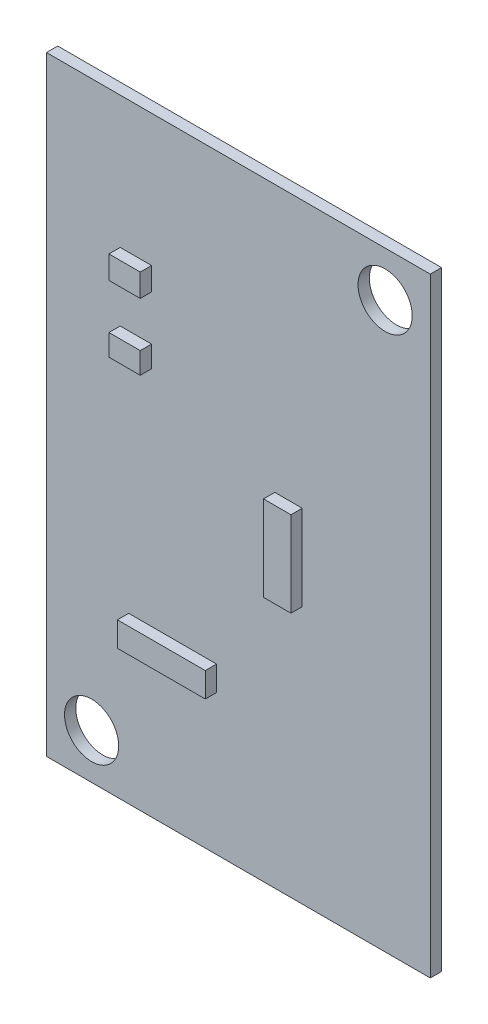
ISO-10303-21;
HEADER;
FILE_DESCRIPTION(('STEP AP214'),'2;1');
FILE_NAME('part.step','',(''),(''),'','','');
FILE_SCHEMA(('AUTOMOTIVE_DESIGN { 1 0 10303 214 1 1 1 1 }'));
ENDSEC;
DATA;
#1=APPLICATION_CONTEXT('core data for automotive mechanical design processes');
#2=APPLICATION_PROTOCOL_DEFINITION('international standard','automotive_design',2000,#1);
#3=PRODUCT_CONTEXT('',#1,'mechanical');
#4=PRODUCT('Part','Part','',(#3));
#5=PRODUCT_RELATED_PRODUCT_CATEGORY('part','',(#4));
#6=PRODUCT_DEFINITION_FORMATION('','',#4);
#7=PRODUCT_DEFINITION_CONTEXT('part definition',#1,'design');
#8=PRODUCT_DEFINITION('design','',#6,#7);
#9=PRODUCT_DEFINITION_SHAPE('','',#8);
#10=(LENGTH_UNIT() NAMED_UNIT(*) SI_UNIT(.MILLI.,.METRE.));
#11=(NAMED_UNIT(*) PLANE_ANGLE_UNIT() SI_UNIT($,.RADIAN.));
#12=(NAMED_UNIT(*) SI_UNIT($,.STERADIAN.) SOLID_ANGLE_UNIT());
#13=UNCERTAINTY_MEASURE_WITH_UNIT(LENGTH_MEASURE(1.E-05),#10,'distance_accuracy_value','');
#14=(GEOMETRIC_REPRESENTATION_CONTEXT(3) GLOBAL_UNCERTAINTY_ASSIGNED_CONTEXT((#13)) GLOBAL_UNIT_ASSIGNED_CONTEXT((#10,
#11,#12)) REPRESENTATION_CONTEXT('',''));
#15=CARTESIAN_POINT('',(0.,0.,0.));
#16=DIRECTION('',(0.,0.,1.));
#17=DIRECTION('',(1.,0.,0.));
#18=AXIS2_PLACEMENT_3D('',#15,#16,#17);
#19=CARTESIAN_POINT('',(0.,0.,0.5));
#20=DIRECTION('',(0.,0.,-1.));
#21=DIRECTION('',(-1.,0.,0.));
#22=AXIS2_PLACEMENT_3D('',#19,#20,#21);
#23=PLANE('',#22);
#24=DIRECTION('',(0.,-1.,0.));
#25=VECTOR('',#24,1.);
#26=CARTESIAN_POINT('',(10.1132934298249,15.1846407659448,0.5));
#27=LINE('',#26,#25);
#28=CARTESIAN_POINT('',(10.1132934298249,15.1846407659448,0.5));
#29=VERTEX_POINT('',#28);
#30=CARTESIAN_POINT('',(10.1132934298249,11.4079215772875,0.5));
#31=VERTEX_POINT('',#30);
#32=EDGE_CURVE('E201',#29,#31,#27,.T.);
#33=ORIENTED_EDGE('',*,*,#32,.F.);
#34=DIRECTION('',(-1.,0.,0.));
#35=VECTOR('',#34,1.);
#36=CARTESIAN_POINT('',(10.1132934298249,15.1846407659448,0.5));
#37=LINE('',#36,#35);
#38=CARTESIAN_POINT('',(11.3299347370059,15.1846407659448,0.5));
#39=VERTEX_POINT('',#38);
#40=EDGE_CURVE('E217',#39,#29,#37,.T.);
#41=ORIENTED_EDGE('',*,*,#40,.F.);
#42=DIRECTION('',(0.,1.,0.));
#43=VECTOR('',#42,1.);
#44=CARTESIAN_POINT('',(11.3299347370059,15.1846407659448,0.5));
#45=LINE('',#44,#43);
#46=CARTESIAN_POINT('',(11.3299347370059,11.4079215772875,0.5));
#47=VERTEX_POINT('',#46);
#48=EDGE_CURVE('E230',#47,#39,#45,.T.);
#49=ORIENTED_EDGE('',*,*,#48,.F.);
#50=DIRECTION('',(1.,0.,0.));
#51=VECTOR('',#50,1.);
#52=CARTESIAN_POINT('',(10.1132934298249,11.4079215772875,0.5));
#53=LINE('',#52,#51);
#54=EDGE_CURVE('E206',#31,#47,#53,.T.);
#55=ORIENTED_EDGE('',*,*,#54,.F.);
#56=EDGE_LOOP('',(#33,#41,#49,#55));
#57=FACE_BOUND('',#56,.T.);
#58=DIRECTION('',(0.,-1.,0.));
#59=VECTOR('',#58,1.);
#60=CARTESIAN_POINT('',(3.26707845600538,21.1574225066613,0.5));
#61=LINE('',#60,#59);
#62=CARTESIAN_POINT('',(3.26707845600538,21.1574225066613,0.5));
#63=VERTEX_POINT('',#62);
#64=CARTESIAN_POINT('',(3.26707845600538,20.1429247999201,0.5));
#65=VERTEX_POINT('',#64);
#66=EDGE_CURVE('E297',#63,#65,#61,.T.);
#67=ORIENTED_EDGE('',*,*,#66,.F.);
#68=DIRECTION('',(-1.,0.,0.));
#69=VECTOR('',#68,1.);
#70=CARTESIAN_POINT('',(3.26707845600538,21.1574225066613,0.5));
#71=LINE('',#70,#69);
#72=CARTESIAN_POINT('',(4.65411513488334,21.1574225066613,0.5));
#73=VERTEX_POINT('',#72);
#74=EDGE_CURVE('E303',#73,#63,#71,.T.);
#75=ORIENTED_EDGE('',*,*,#74,.F.);
#76=DIRECTION('',(0.,1.,0.));
#77=VECTOR('',#76,1.);
#78=CARTESIAN_POINT('',(4.65411513488334,21.1574225066613,0.5));
#79=LINE('',#78,#77);
#80=CARTESIAN_POINT('',(4.65411513488334,20.1429247999201,0.5));
#81=VERTEX_POINT('',#80);
#82=EDGE_CURVE('E320',#81,#73,#79,.T.);
#83=ORIENTED_EDGE('',*,*,#82,.F.);
#84=DIRECTION('',(1.,0.,0.));
#85=VECTOR('',#84,1.);
#86=CARTESIAN_POINT('',(3.26707845600538,20.1429247999201,0.5));
#87=LINE('',#86,#85);
#88=EDGE_CURVE('E316',#65,#81,#87,.T.);
#89=ORIENTED_EDGE('',*,*,#88,.F.);
#90=EDGE_LOOP('',(#67,#75,#83,#89));
#91=FACE_BOUND('',#90,.T.);
#92=CARTESIAN_POINT('',(1.99999999999999,2.,0.5));
#93=DIRECTION('',(0.,0.,1.));
#94=DIRECTION('',(1.,0.,0.));
#95=AXIS2_PLACEMENT_3D('',#92,#93,#94);
#96=CIRCLE('',#95,1.2);
#97=CARTESIAN_POINT('',(3.19999999999999,2.,0.5));
#98=VERTEX_POINT('',#97);
#99=EDGE_CURVE('E343',#98,#98,#96,.T.);
#100=ORIENTED_EDGE('',*,*,#99,.F.);
#101=EDGE_LOOP('',(#100));
#102=FACE_BOUND('',#101,.T.);
#103=CARTESIAN_POINT('',(15.,25.,0.5));
#104=DIRECTION('',(0.,0.,1.));
#105=DIRECTION('',(1.,0.,0.));
#106=AXIS2_PLACEMENT_3D('',#103,#104,#105);
#107=CIRCLE('',#106,1.2);
#108=CARTESIAN_POINT('',(16.2,25.,0.5));
#109=VERTEX_POINT('',#108);
#110=EDGE_CURVE('E342',#109,#109,#107,.T.);
#111=ORIENTED_EDGE('',*,*,#110,.F.);
#112=EDGE_LOOP('',(#111));
#113=FACE_BOUND('',#112,.T.);
#114=DIRECTION('',(0.,-1.,0.));
#115=VECTOR('',#114,1.);
#116=CARTESIAN_POINT('',(0.,0.,0.5));
#117=LINE('',#116,#115);
#118=CARTESIAN_POINT('',(0.,27.,0.5));
#119=VERTEX_POINT('',#118);
#120=CARTESIAN_POINT('',(0.,0.,0.5));
#121=VERTEX_POINT('',#120);
#122=EDGE_CURVE('E359',#119,#121,#117,.T.);
#123=ORIENTED_EDGE('',*,*,#122,.T.);
#124=DIRECTION('',(1.,0.,0.));
#125=VECTOR('',#124,1.);
#126=CARTESIAN_POINT('',(0.,0.,0.5));
#127=LINE('',#126,#125);
#128=CARTESIAN_POINT('',(17.,0.,0.5));
#129=VERTEX_POINT('',#128);
#130=EDGE_CURVE('E363',#121,#129,#127,.T.);
#131=ORIENTED_EDGE('',*,*,#130,.T.);
#132=DIRECTION('',(0.,1.,0.));
#133=VECTOR('',#132,1.);
#134=CARTESIAN_POINT('',(17.,0.,0.5));
#135=LINE('',#134,#133);
#136=CARTESIAN_POINT('',(17.,27.,0.5));
#137=VERTEX_POINT('',#136);
#138=EDGE_CURVE('E367',#129,#137,#135,.T.);
#139=ORIENTED_EDGE('',*,*,#138,.T.);
#140=DIRECTION('',(-1.,0.,0.));
#141=VECTOR('',#140,1.);
#142=CARTESIAN_POINT('',(0.,27.,0.5));
#143=LINE('',#142,#141);
#144=EDGE_CURVE('E370',#137,#119,#143,.T.);
#145=ORIENTED_EDGE('',*,*,#144,.T.);
#146=EDGE_LOOP('',(#123,#131,#139,#145));
#147=FACE_BOUND('',#146,.T.);
#148=DIRECTION('',(0.,-1.,0.));
#149=VECTOR('',#148,1.);
#150=CARTESIAN_POINT('',(3.26707845600538,18.1441707951748,0.5));
#151=LINE('',#150,#149);
#152=CARTESIAN_POINT('',(3.26707845600538,18.1441707951748,0.5));
#153=VERTEX_POINT('',#152);
#154=CARTESIAN_POINT('',(3.26707845600538,17.1966777351997,0.5));
#155=VERTEX_POINT('',#154);
#156=EDGE_CURVE('E252',#153,#155,#151,.T.);
#157=ORIENTED_EDGE('',*,*,#156,.F.);
#158=DIRECTION('',(-1.,0.,0.));
#159=VECTOR('',#158,1.);
#160=CARTESIAN_POINT('',(3.26707845600538,18.1441707951748,0.5));
#161=LINE('',#160,#159);
#162=CARTESIAN_POINT('',(4.65411513488334,18.1441707951748,0.5));
#163=VERTEX_POINT('',#162);
#164=EDGE_CURVE('E258',#163,#153,#161,.T.);
#165=ORIENTED_EDGE('',*,*,#164,.F.);
#166=DIRECTION('',(0.,1.,0.));
#167=VECTOR('',#166,1.);
#168=CARTESIAN_POINT('',(4.65411513488334,18.1441707951748,0.5));
#169=LINE('',#168,#167);
#170=CARTESIAN_POINT('',(4.65411513488334,17.1966777351997,0.5));
#171=VERTEX_POINT('',#170);
#172=EDGE_CURVE('E275',#171,#163,#169,.T.);
#173=ORIENTED_EDGE('',*,*,#172,.F.);
#174=DIRECTION('',(1.,0.,0.));
#175=VECTOR('',#174,1.);
#176=CARTESIAN_POINT('',(3.26707845600538,17.1966777351997,0.5));
#177=LINE('',#176,#175);
#178=EDGE_CURVE('E271',#155,#171,#177,.T.);
#179=ORIENTED_EDGE('',*,*,#178,.F.);
#180=EDGE_LOOP('',(#157,#165,#173,#179));
#181=FACE_BOUND('',#180,.T.);
#182=DIRECTION('',(0.,-1.,0.));
#183=VECTOR('',#182,1.);
#184=CARTESIAN_POINT('',(3.64241793720055,7.3104408157576,0.5));
#185=LINE('',#184,#183);
#186=CARTESIAN_POINT('',(3.64241793720055,7.3104408157576,0.5));
#187=VERTEX_POINT('',#186);
#188=CARTESIAN_POINT('',(3.64241793720055,6.21853176052412,0.5));
#189=VERTEX_POINT('',#188);
#190=EDGE_CURVE('E199',#187,#189,#185,.T.);
#191=ORIENTED_EDGE('',*,*,#190,.F.);
#192=DIRECTION('',(-1.,0.,0.));
#193=VECTOR('',#192,1.);
#194=CARTESIAN_POINT('',(3.64241793720055,7.3104408157576,0.5));
#195=LINE('',#194,#193);
#196=CARTESIAN_POINT('',(7.5348135851101,7.3104408157576,0.5));
#197=VERTEX_POINT('',#196);
#198=EDGE_CURVE('E196',#197,#187,#195,.T.);
#199=ORIENTED_EDGE('',*,*,#198,.F.);
#200=DIRECTION('',(0.,1.,0.));
#201=VECTOR('',#200,1.);
#202=CARTESIAN_POINT('',(7.5348135851101,7.3104408157576,0.5));
#203=LINE('',#202,#201);
#204=CARTESIAN_POINT('',(7.5348135851101,6.21853176052412,0.5));
#205=VERTEX_POINT('',#204);
#206=EDGE_CURVE('E60',#205,#197,#203,.T.);
#207=ORIENTED_EDGE('',*,*,#206,.F.);
#208=DIRECTION('',(1.,0.,0.));
#209=VECTOR('',#208,1.);
#210=CARTESIAN_POINT('',(3.64241793720055,6.21853176052412,0.5));
#211=LINE('',#210,#209);
#212=EDGE_CURVE('E55',#189,#205,#211,.T.);
#213=ORIENTED_EDGE('',*,*,#212,.F.);
#214=EDGE_LOOP('',(#191,#199,#207,#213));
#215=FACE_BOUND('',#214,.T.);
#216=ADVANCED_FACE('F39',(#57,#91,#102,#113,#147,#181,#215),#23,.F.);
#217=CARTESIAN_POINT('',(0.,0.,0.5));
#218=DIRECTION('',(1.,0.,0.));
#219=DIRECTION('',(0.,1.,0.));
#220=AXIS2_PLACEMENT_3D('',#217,#218,#219);
#221=PLANE('',#220);
#222=DIRECTION('',(0.,-1.,0.));
#223=VECTOR('',#222,1.);
#224=CARTESIAN_POINT('',(0.,0.,0.));
#225=LINE('',#224,#223);
#226=CARTESIAN_POINT('',(0.,27.,0.));
#227=VERTEX_POINT('',#226);
#228=CARTESIAN_POINT('',(0.,0.,0.));
#229=VERTEX_POINT('',#228);
#230=EDGE_CURVE('E352',#227,#229,#225,.T.);
#231=ORIENTED_EDGE('',*,*,#230,.T.);
#232=DIRECTION('',(0.,0.,-1.));
#233=VECTOR('',#232,1.);
#234=CARTESIAN_POINT('',(0.,0.,0.5));
#235=LINE('',#234,#233);
#236=EDGE_CURVE('E11',#121,#229,#235,.T.);
#237=ORIENTED_EDGE('',*,*,#236,.F.);
#238=ORIENTED_EDGE('',*,*,#122,.F.);
#239=DIRECTION('',(0.,0.,-1.));
#240=VECTOR('',#239,1.);
#241=CARTESIAN_POINT('',(0.,27.,0.5));
#242=LINE('',#241,#240);
#243=EDGE_CURVE('E373',#119,#227,#242,.T.);
#244=ORIENTED_EDGE('',*,*,#243,.T.);
#245=EDGE_LOOP('',(#231,#237,#238,#244));
#246=FACE_BOUND('',#245,.T.);
#247=ADVANCED_FACE('F41',(#246),#221,.F.);
#248=CARTESIAN_POINT('',(0.,0.,0.5));
#249=DIRECTION('',(0.,1.,0.));
#250=DIRECTION('',(0.,0.,1.));
#251=AXIS2_PLACEMENT_3D('',#248,#249,#250);
#252=PLANE('',#251);
#253=DIRECTION('',(1.,0.,0.));
#254=VECTOR('',#253,1.);
#255=CARTESIAN_POINT('',(0.,0.,0.));
#256=LINE('',#255,#254);
#257=CARTESIAN_POINT('',(17.,0.,0.));
#258=VERTEX_POINT('',#257);
#259=EDGE_CURVE('E377',#229,#258,#256,.T.);
#260=ORIENTED_EDGE('',*,*,#259,.T.);
#261=DIRECTION('',(0.,0.,-1.));
#262=VECTOR('',#261,1.);
#263=CARTESIAN_POINT('',(17.,0.,0.5));
#264=LINE('',#263,#262);
#265=EDGE_CURVE('E48',#129,#258,#264,.T.);
#266=ORIENTED_EDGE('',*,*,#265,.F.);
#267=ORIENTED_EDGE('',*,*,#130,.F.);
#268=ORIENTED_EDGE('',*,*,#236,.T.);
#269=EDGE_LOOP('',(#260,#266,#267,#268));
#270=FACE_BOUND('',#269,.T.);
#271=ADVANCED_FACE('F413',(#270),#252,.F.);
#272=CARTESIAN_POINT('',(17.,0.,0.5));
#273=DIRECTION('',(-1.,0.,0.));
#274=DIRECTION('',(0.,-1.,0.));
#275=AXIS2_PLACEMENT_3D('',#272,#273,#274);
#276=PLANE('',#275);
#277=DIRECTION('',(0.,1.,0.));
#278=VECTOR('',#277,1.);
#279=CARTESIAN_POINT('',(17.,0.,0.));
#280=LINE('',#279,#278);
#281=CARTESIAN_POINT('',(17.,27.,0.));
#282=VERTEX_POINT('',#281);
#283=EDGE_CURVE('E380',#258,#282,#280,.T.);
#284=ORIENTED_EDGE('',*,*,#283,.T.);
#285=DIRECTION('',(0.,0.,-1.));
#286=VECTOR('',#285,1.);
#287=CARTESIAN_POINT('',(17.,27.,0.5));
#288=LINE('',#287,#286);
#289=EDGE_CURVE('E388',#137,#282,#288,.T.);
#290=ORIENTED_EDGE('',*,*,#289,.F.);
#291=ORIENTED_EDGE('',*,*,#138,.F.);
#292=ORIENTED_EDGE('',*,*,#265,.T.);
#293=EDGE_LOOP('',(#284,#290,#291,#292));
#294=FACE_BOUND('',#293,.T.);
#295=ADVANCED_FACE('F397',(#294),#276,.F.);
#296=CARTESIAN_POINT('',(0.,27.,0.5));
#297=DIRECTION('',(0.,-1.,0.));
#298=DIRECTION('',(0.,0.,-1.));
#299=AXIS2_PLACEMENT_3D('',#296,#297,#298);
#300=PLANE('',#299);
#301=DIRECTION('',(-1.,0.,0.));
#302=VECTOR('',#301,1.);
#303=CARTESIAN_POINT('',(0.,27.,0.));
#304=LINE('',#303,#302);
#305=EDGE_CURVE('E364',#282,#227,#304,.T.);
#306=ORIENTED_EDGE('',*,*,#305,.T.);
#307=ORIENTED_EDGE('',*,*,#243,.F.);
#308=ORIENTED_EDGE('',*,*,#144,.F.);
#309=ORIENTED_EDGE('',*,*,#289,.T.);
#310=EDGE_LOOP('',(#306,#307,#308,#309));
#311=FACE_BOUND('',#310,.T.);
#312=ADVANCED_FACE('F406',(#311),#300,.F.);
#313=CARTESIAN_POINT('',(0.,0.,0.));
#314=DIRECTION('',(0.,0.,-1.));
#315=DIRECTION('',(-1.,0.,0.));
#316=AXIS2_PLACEMENT_3D('',#313,#314,#315);
#317=PLANE('',#316);
#318=CARTESIAN_POINT('',(1.99999999999999,2.,0.));
#319=DIRECTION('',(0.,0.,-1.));
#320=DIRECTION('',(-1.,0.,0.));
#321=AXIS2_PLACEMENT_3D('',#318,#319,#320);
#322=CIRCLE('',#321,1.2);
#323=CARTESIAN_POINT('',(0.799999999999995,2.,0.));
#324=VERTEX_POINT('',#323);
#325=EDGE_CURVE('E347',#324,#324,#322,.F.);
#326=ORIENTED_EDGE('',*,*,#325,.T.);
#327=EDGE_LOOP('',(#326));
#328=FACE_BOUND('',#327,.T.);
#329=CARTESIAN_POINT('',(15.,25.,0.));
#330=DIRECTION('',(0.,0.,-1.));
#331=DIRECTION('',(-1.,0.,0.));
#332=AXIS2_PLACEMENT_3D('',#329,#330,#331);
#333=CIRCLE('',#332,1.2);
#334=CARTESIAN_POINT('',(13.8,25.,0.));
#335=VERTEX_POINT('',#334);
#336=EDGE_CURVE('E348',#335,#335,#333,.F.);
#337=ORIENTED_EDGE('',*,*,#336,.T.);
#338=EDGE_LOOP('',(#337));
#339=FACE_BOUND('',#338,.T.);
#340=ORIENTED_EDGE('',*,*,#230,.F.);
#341=ORIENTED_EDGE('',*,*,#305,.F.);
#342=ORIENTED_EDGE('',*,*,#283,.F.);
#343=ORIENTED_EDGE('',*,*,#259,.F.);
#344=EDGE_LOOP('',(#340,#341,#342,#343));
#345=FACE_BOUND('',#344,.T.);
#346=ADVANCED_FACE('F403',(#328,#339,#345),#317,.T.);
#347=CARTESIAN_POINT('',(15.,25.,-3.39411254969543));
#348=DIRECTION('',(0.,0.,1.));
#349=DIRECTION('',(1.,0.,0.));
#350=AXIS2_PLACEMENT_3D('',#347,#348,#349);
#351=CYLINDRICAL_SURFACE('',#350,1.2);
#352=ORIENTED_EDGE('',*,*,#110,.T.);
#353=EDGE_LOOP('',(#352));
#354=FACE_BOUND('',#353,.T.);
#355=ORIENTED_EDGE('',*,*,#336,.F.);
#356=EDGE_LOOP('',(#355));
#357=FACE_BOUND('',#356,.T.);
#358=ADVANCED_FACE('F428',(#354,#357),#351,.F.);
#359=CARTESIAN_POINT('',(1.99999999999999,2.,-3.39411254969543));
#360=DIRECTION('',(0.,0.,1.));
#361=DIRECTION('',(1.,0.,0.));
#362=AXIS2_PLACEMENT_3D('',#359,#360,#361);
#363=CYLINDRICAL_SURFACE('',#362,1.2);
#364=ORIENTED_EDGE('',*,*,#99,.T.);
#365=EDGE_LOOP('',(#364));
#366=FACE_BOUND('',#365,.T.);
#367=ORIENTED_EDGE('',*,*,#325,.F.);
#368=EDGE_LOOP('',(#367));
#369=FACE_BOUND('',#368,.T.);
#370=ADVANCED_FACE('F448',(#366,#369),#363,.F.);
#371=CARTESIAN_POINT('',(3.26707845600538,21.1574225066613,1.));
#372=DIRECTION('',(1.,0.,0.));
#373=DIRECTION('',(0.,0.,-1.));
#374=AXIS2_PLACEMENT_3D('',#371,#372,#373);
#375=PLANE('',#374);
#376=ORIENTED_EDGE('',*,*,#66,.T.);
#377=DIRECTION('',(0.,0.,-1.));
#378=VECTOR('',#377,1.);
#379=CARTESIAN_POINT('',(3.26707845600538,20.1429247999201,1.));
#380=LINE('',#379,#378);
#381=CARTESIAN_POINT('',(3.26707845600538,20.1429247999201,1.));
#382=VERTEX_POINT('',#381);
#383=EDGE_CURVE('E338',#382,#65,#380,.T.);
#384=ORIENTED_EDGE('',*,*,#383,.F.);
#385=DIRECTION('',(0.,-1.,0.));
#386=VECTOR('',#385,1.);
#387=CARTESIAN_POINT('',(3.26707845600538,21.1574225066613,1.));
#388=LINE('',#387,#386);
#389=CARTESIAN_POINT('',(3.26707845600538,21.1574225066613,1.));
#390=VERTEX_POINT('',#389);
#391=EDGE_CURVE('E298',#390,#382,#388,.T.);
#392=ORIENTED_EDGE('',*,*,#391,.F.);
#393=DIRECTION('',(0.,0.,-1.));
#394=VECTOR('',#393,1.);
#395=CARTESIAN_POINT('',(3.26707845600538,21.1574225066613,1.));
#396=LINE('',#395,#394);
#397=EDGE_CURVE('E312',#390,#63,#396,.T.);
#398=ORIENTED_EDGE('',*,*,#397,.T.);
#399=EDGE_LOOP('',(#376,#384,#392,#398));
#400=FACE_BOUND('',#399,.T.);
#401=ADVANCED_FACE('F455',(#400),#375,.F.);
#402=CARTESIAN_POINT('',(3.26707845600538,20.1429247999201,1.));
#403=DIRECTION('',(0.,1.,0.));
#404=DIRECTION('',(0.,0.,1.));
#405=AXIS2_PLACEMENT_3D('',#402,#403,#404);
#406=PLANE('',#405);
#407=ORIENTED_EDGE('',*,*,#88,.T.);
#408=DIRECTION('',(0.,0.,-1.));
#409=VECTOR('',#408,1.);
#410=CARTESIAN_POINT('',(4.65411513488334,20.1429247999201,1.));
#411=LINE('',#410,#409);
#412=CARTESIAN_POINT('',(4.65411513488334,20.1429247999201,1.));
#413=VERTEX_POINT('',#412);
#414=EDGE_CURVE('E334',#413,#81,#411,.T.);
#415=ORIENTED_EDGE('',*,*,#414,.F.);
#416=DIRECTION('',(1.,0.,0.));
#417=VECTOR('',#416,1.);
#418=CARTESIAN_POINT('',(3.26707845600538,20.1429247999201,1.));
#419=LINE('',#418,#417);
#420=EDGE_CURVE('E302',#382,#413,#419,.T.);
#421=ORIENTED_EDGE('',*,*,#420,.F.);
#422=ORIENTED_EDGE('',*,*,#383,.T.);
#423=EDGE_LOOP('',(#407,#415,#421,#422));
#424=FACE_BOUND('',#423,.T.);
#425=ADVANCED_FACE('F462',(#424),#406,.F.);
#426=CARTESIAN_POINT('',(4.65411513488334,21.1574225066613,1.));
#427=DIRECTION('',(-1.,0.,0.));
#428=DIRECTION('',(0.,0.,1.));
#429=AXIS2_PLACEMENT_3D('',#426,#427,#428);
#430=PLANE('',#429);
#431=ORIENTED_EDGE('',*,*,#82,.T.);
#432=DIRECTION('',(0.,0.,-1.));
#433=VECTOR('',#432,1.);
#434=CARTESIAN_POINT('',(4.65411513488334,21.1574225066613,1.));
#435=LINE('',#434,#433);
#436=CARTESIAN_POINT('',(4.65411513488334,21.1574225066613,1.));
#437=VERTEX_POINT('',#436);
#438=EDGE_CURVE('E330',#437,#73,#435,.T.);
#439=ORIENTED_EDGE('',*,*,#438,.F.);
#440=DIRECTION('',(0.,1.,0.));
#441=VECTOR('',#440,1.);
#442=CARTESIAN_POINT('',(4.65411513488334,21.1574225066613,1.));
#443=LINE('',#442,#441);
#444=EDGE_CURVE('E306',#413,#437,#443,.T.);
#445=ORIENTED_EDGE('',*,*,#444,.F.);
#446=ORIENTED_EDGE('',*,*,#414,.T.);
#447=EDGE_LOOP('',(#431,#439,#445,#446));
#448=FACE_BOUND('',#447,.T.);
#449=ADVANCED_FACE('F470',(#448),#430,.F.);
#450=CARTESIAN_POINT('',(3.26707845600538,21.1574225066613,1.));
#451=DIRECTION('',(0.,-1.,0.));
#452=DIRECTION('',(0.,0.,-1.));
#453=AXIS2_PLACEMENT_3D('',#450,#451,#452);
#454=PLANE('',#453);
#455=ORIENTED_EDGE('',*,*,#74,.T.);
#456=ORIENTED_EDGE('',*,*,#397,.F.);
#457=DIRECTION('',(-1.,0.,0.));
#458=VECTOR('',#457,1.);
#459=CARTESIAN_POINT('',(3.26707845600538,21.1574225066613,1.));
#460=LINE('',#459,#458);
#461=EDGE_CURVE('E309',#437,#390,#460,.T.);
#462=ORIENTED_EDGE('',*,*,#461,.F.);
#463=ORIENTED_EDGE('',*,*,#438,.T.);
#464=EDGE_LOOP('',(#455,#456,#462,#463));
#465=FACE_BOUND('',#464,.T.);
#466=ADVANCED_FACE('F478',(#465),#454,.F.);
#467=CARTESIAN_POINT('',(0.,0.,1.));
#468=DIRECTION('',(0.,0.,1.));
#469=DIRECTION('',(1.,0.,0.));
#470=AXIS2_PLACEMENT_3D('',#467,#468,#469);
#471=PLANE('',#470);
#472=ORIENTED_EDGE('',*,*,#391,.T.);
#473=ORIENTED_EDGE('',*,*,#420,.T.);
#474=ORIENTED_EDGE('',*,*,#444,.T.);
#475=ORIENTED_EDGE('',*,*,#461,.T.);
#476=EDGE_LOOP('',(#472,#473,#474,#475));
#477=FACE_BOUND('',#476,.T.);
#478=ADVANCED_FACE('F486',(#477),#471,.T.);
#479=CARTESIAN_POINT('',(3.26707845600538,18.1441707951748,1.));
#480=DIRECTION('',(1.,0.,0.));
#481=DIRECTION('',(0.,0.,-1.));
#482=AXIS2_PLACEMENT_3D('',#479,#480,#481);
#483=PLANE('',#482);
#484=ORIENTED_EDGE('',*,*,#156,.T.);
#485=DIRECTION('',(0.,0.,-1.));
#486=VECTOR('',#485,1.);
#487=CARTESIAN_POINT('',(3.26707845600538,17.1966777351997,1.));
#488=LINE('',#487,#486);
#489=CARTESIAN_POINT('',(3.26707845600538,17.1966777351997,1.));
#490=VERTEX_POINT('',#489);
#491=EDGE_CURVE('E293',#490,#155,#488,.T.);
#492=ORIENTED_EDGE('',*,*,#491,.F.);
#493=DIRECTION('',(0.,-1.,0.));
#494=VECTOR('',#493,1.);
#495=CARTESIAN_POINT('',(3.26707845600538,18.1441707951748,1.));
#496=LINE('',#495,#494);
#497=CARTESIAN_POINT('',(3.26707845600538,18.1441707951748,1.));
#498=VERTEX_POINT('',#497);
#499=EDGE_CURVE('E253',#498,#490,#496,.T.);
#500=ORIENTED_EDGE('',*,*,#499,.F.);
#501=DIRECTION('',(0.,0.,-1.));
#502=VECTOR('',#501,1.);
#503=CARTESIAN_POINT('',(3.26707845600538,18.1441707951748,1.));
#504=LINE('',#503,#502);
#505=EDGE_CURVE('E267',#498,#153,#504,.T.);
#506=ORIENTED_EDGE('',*,*,#505,.T.);
#507=EDGE_LOOP('',(#484,#492,#500,#506));
#508=FACE_BOUND('',#507,.T.);
#509=ADVANCED_FACE('F494',(#508),#483,.F.);
#510=CARTESIAN_POINT('',(3.26707845600538,17.1966777351997,1.));
#511=DIRECTION('',(0.,1.,0.));
#512=DIRECTION('',(0.,0.,1.));
#513=AXIS2_PLACEMENT_3D('',#510,#511,#512);
#514=PLANE('',#513);
#515=ORIENTED_EDGE('',*,*,#178,.T.);
#516=DIRECTION('',(0.,0.,-1.));
#517=VECTOR('',#516,1.);
#518=CARTESIAN_POINT('',(4.65411513488334,17.1966777351997,1.));
#519=LINE('',#518,#517);
#520=CARTESIAN_POINT('',(4.65411513488334,17.1966777351997,1.));
#521=VERTEX_POINT('',#520);
#522=EDGE_CURVE('E289',#521,#171,#519,.T.);
#523=ORIENTED_EDGE('',*,*,#522,.F.);
#524=DIRECTION('',(1.,0.,0.));
#525=VECTOR('',#524,1.);
#526=CARTESIAN_POINT('',(3.26707845600538,17.1966777351997,1.));
#527=LINE('',#526,#525);
#528=EDGE_CURVE('E257',#490,#521,#527,.T.);
#529=ORIENTED_EDGE('',*,*,#528,.F.);
#530=ORIENTED_EDGE('',*,*,#491,.T.);
#531=EDGE_LOOP('',(#515,#523,#529,#530));
#532=FACE_BOUND('',#531,.T.);
#533=ADVANCED_FACE('F502',(#532),#514,.F.);
#534=CARTESIAN_POINT('',(4.65411513488334,18.1441707951748,1.));
#535=DIRECTION('',(-1.,0.,0.));
#536=DIRECTION('',(0.,0.,1.));
#537=AXIS2_PLACEMENT_3D('',#534,#535,#536);
#538=PLANE('',#537);
#539=ORIENTED_EDGE('',*,*,#172,.T.);
#540=DIRECTION('',(0.,0.,-1.));
#541=VECTOR('',#540,1.);
#542=CARTESIAN_POINT('',(4.65411513488334,18.1441707951748,1.));
#543=LINE('',#542,#541);
#544=CARTESIAN_POINT('',(4.65411513488334,18.1441707951748,1.));
#545=VERTEX_POINT('',#544);
#546=EDGE_CURVE('E285',#545,#163,#543,.T.);
#547=ORIENTED_EDGE('',*,*,#546,.F.);
#548=DIRECTION('',(0.,1.,0.));
#549=VECTOR('',#548,1.);
#550=CARTESIAN_POINT('',(4.65411513488334,18.1441707951748,1.));
#551=LINE('',#550,#549);
#552=EDGE_CURVE('E261',#521,#545,#551,.T.);
#553=ORIENTED_EDGE('',*,*,#552,.F.);
#554=ORIENTED_EDGE('',*,*,#522,.T.);
#555=EDGE_LOOP('',(#539,#547,#553,#554));
#556=FACE_BOUND('',#555,.T.);
#557=ADVANCED_FACE('F510',(#556),#538,.F.);
#558=CARTESIAN_POINT('',(3.26707845600538,18.1441707951748,1.));
#559=DIRECTION('',(0.,-1.,0.));
#560=DIRECTION('',(0.,0.,-1.));
#561=AXIS2_PLACEMENT_3D('',#558,#559,#560);
#562=PLANE('',#561);
#563=ORIENTED_EDGE('',*,*,#164,.T.);
#564=ORIENTED_EDGE('',*,*,#505,.F.);
#565=DIRECTION('',(-1.,0.,0.));
#566=VECTOR('',#565,1.);
#567=CARTESIAN_POINT('',(3.26707845600538,18.1441707951748,1.));
#568=LINE('',#567,#566);
#569=EDGE_CURVE('E264',#545,#498,#568,.T.);
#570=ORIENTED_EDGE('',*,*,#569,.F.);
#571=ORIENTED_EDGE('',*,*,#546,.T.);
#572=EDGE_LOOP('',(#563,#564,#570,#571));
#573=FACE_BOUND('',#572,.T.);
#574=ADVANCED_FACE('F518',(#573),#562,.F.);
#575=CARTESIAN_POINT('',(0.,0.,1.));
#576=DIRECTION('',(0.,0.,1.));
#577=DIRECTION('',(1.,0.,0.));
#578=AXIS2_PLACEMENT_3D('',#575,#576,#577);
#579=PLANE('',#578);
#580=ORIENTED_EDGE('',*,*,#499,.T.);
#581=ORIENTED_EDGE('',*,*,#528,.T.);
#582=ORIENTED_EDGE('',*,*,#552,.T.);
#583=ORIENTED_EDGE('',*,*,#569,.T.);
#584=EDGE_LOOP('',(#580,#581,#582,#583));
#585=FACE_BOUND('',#584,.T.);
#586=ADVANCED_FACE('F526',(#585),#579,.T.);
#587=CARTESIAN_POINT('',(10.1132934298249,15.1846407659448,1.));
#588=DIRECTION('',(1.,0.,0.));
#589=DIRECTION('',(0.,0.,-1.));
#590=AXIS2_PLACEMENT_3D('',#587,#588,#589);
#591=PLANE('',#590);
#592=ORIENTED_EDGE('',*,*,#32,.T.);
#593=DIRECTION('',(0.,0.,-1.));
#594=VECTOR('',#593,1.);
#595=CARTESIAN_POINT('',(10.1132934298249,11.4079215772875,1.));
#596=LINE('',#595,#594);
#597=CARTESIAN_POINT('',(10.1132934298249,11.4079215772875,1.));
#598=VERTEX_POINT('',#597);
#599=EDGE_CURVE('E248',#598,#31,#596,.T.);
#600=ORIENTED_EDGE('',*,*,#599,.F.);
#601=DIRECTION('',(0.,-1.,0.));
#602=VECTOR('',#601,1.);
#603=CARTESIAN_POINT('',(10.1132934298249,15.1846407659448,1.));
#604=LINE('',#603,#602);
#605=CARTESIAN_POINT('',(10.1132934298249,15.1846407659448,1.));
#606=VERTEX_POINT('',#605);
#607=EDGE_CURVE('E212',#606,#598,#604,.T.);
#608=ORIENTED_EDGE('',*,*,#607,.F.);
#609=DIRECTION('',(0.,0.,-1.));
#610=VECTOR('',#609,1.);
#611=CARTESIAN_POINT('',(10.1132934298249,15.1846407659448,1.));
#612=LINE('',#611,#610);
#613=EDGE_CURVE('E225',#606,#29,#612,.T.);
#614=ORIENTED_EDGE('',*,*,#613,.T.);
#615=EDGE_LOOP('',(#592,#600,#608,#614));
#616=FACE_BOUND('',#615,.T.);
#617=ADVANCED_FACE('F534',(#616),#591,.F.);
#618=CARTESIAN_POINT('',(10.1132934298249,11.4079215772875,1.));
#619=DIRECTION('',(0.,1.,0.));
#620=DIRECTION('',(0.,0.,1.));
#621=AXIS2_PLACEMENT_3D('',#618,#619,#620);
#622=PLANE('',#621);
#623=ORIENTED_EDGE('',*,*,#54,.T.);
#624=DIRECTION('',(0.,0.,-1.));
#625=VECTOR('',#624,1.);
#626=CARTESIAN_POINT('',(11.3299347370059,11.4079215772875,1.));
#627=LINE('',#626,#625);
#628=CARTESIAN_POINT('',(11.3299347370059,11.4079215772875,1.));
#629=VERTEX_POINT('',#628);
#630=EDGE_CURVE('E244',#629,#47,#627,.T.);
#631=ORIENTED_EDGE('',*,*,#630,.F.);
#632=DIRECTION('',(1.,0.,0.));
#633=VECTOR('',#632,1.);
#634=CARTESIAN_POINT('',(10.1132934298249,11.4079215772875,1.));
#635=LINE('',#634,#633);
#636=EDGE_CURVE('E216',#598,#629,#635,.T.);
#637=ORIENTED_EDGE('',*,*,#636,.F.);
#638=ORIENTED_EDGE('',*,*,#599,.T.);
#639=EDGE_LOOP('',(#623,#631,#637,#638));
#640=FACE_BOUND('',#639,.T.);
#641=ADVANCED_FACE('F542',(#640),#622,.F.);
#642=CARTESIAN_POINT('',(11.3299347370059,15.1846407659448,1.));
#643=DIRECTION('',(-1.,0.,0.));
#644=DIRECTION('',(0.,0.,1.));
#645=AXIS2_PLACEMENT_3D('',#642,#643,#644);
#646=PLANE('',#645);
#647=ORIENTED_EDGE('',*,*,#48,.T.);
#648=DIRECTION('',(0.,0.,-1.));
#649=VECTOR('',#648,1.);
#650=CARTESIAN_POINT('',(11.3299347370059,15.1846407659448,1.));
#651=LINE('',#650,#649);
#652=CARTESIAN_POINT('',(11.3299347370059,15.1846407659448,1.));
#653=VERTEX_POINT('',#652);
#654=EDGE_CURVE('E240',#653,#39,#651,.T.);
#655=ORIENTED_EDGE('',*,*,#654,.F.);
#656=DIRECTION('',(0.,1.,0.));
#657=VECTOR('',#656,1.);
#658=CARTESIAN_POINT('',(11.3299347370059,15.1846407659448,1.));
#659=LINE('',#658,#657);
#660=EDGE_CURVE('E220',#629,#653,#659,.T.);
#661=ORIENTED_EDGE('',*,*,#660,.F.);
#662=ORIENTED_EDGE('',*,*,#630,.T.);
#663=EDGE_LOOP('',(#647,#655,#661,#662));
#664=FACE_BOUND('',#663,.T.);
#665=ADVANCED_FACE('F550',(#664),#646,.F.);
#666=CARTESIAN_POINT('',(10.1132934298249,15.1846407659448,1.));
#667=DIRECTION('',(0.,-1.,0.));
#668=DIRECTION('',(0.,0.,-1.));
#669=AXIS2_PLACEMENT_3D('',#666,#667,#668);
#670=PLANE('',#669);
#671=ORIENTED_EDGE('',*,*,#40,.T.);
#672=ORIENTED_EDGE('',*,*,#613,.F.);
#673=DIRECTION('',(-1.,0.,0.));
#674=VECTOR('',#673,1.);
#675=CARTESIAN_POINT('',(10.1132934298249,15.1846407659448,1.));
#676=LINE('',#675,#674);
#677=EDGE_CURVE('E223',#653,#606,#676,.T.);
#678=ORIENTED_EDGE('',*,*,#677,.F.);
#679=ORIENTED_EDGE('',*,*,#654,.T.);
#680=EDGE_LOOP('',(#671,#672,#678,#679));
#681=FACE_BOUND('',#680,.T.);
#682=ADVANCED_FACE('F558',(#681),#670,.F.);
#683=CARTESIAN_POINT('',(0.,0.,1.));
#684=DIRECTION('',(0.,0.,1.));
#685=DIRECTION('',(1.,0.,0.));
#686=AXIS2_PLACEMENT_3D('',#683,#684,#685);
#687=PLANE('',#686);
#688=ORIENTED_EDGE('',*,*,#607,.T.);
#689=ORIENTED_EDGE('',*,*,#636,.T.);
#690=ORIENTED_EDGE('',*,*,#660,.T.);
#691=ORIENTED_EDGE('',*,*,#677,.T.);
#692=EDGE_LOOP('',(#688,#689,#690,#691));
#693=FACE_BOUND('',#692,.T.);
#694=ADVANCED_FACE('F566',(#693),#687,.T.);
#695=CARTESIAN_POINT('',(3.64241793720055,7.3104408157576,1.));
#696=DIRECTION('',(1.,0.,0.));
#697=DIRECTION('',(0.,0.,-1.));
#698=AXIS2_PLACEMENT_3D('',#695,#696,#697);
#699=PLANE('',#698);
#700=ORIENTED_EDGE('',*,*,#190,.T.);
#701=DIRECTION('',(0.,0.,-1.));
#702=VECTOR('',#701,1.);
#703=CARTESIAN_POINT('',(3.64241793720055,6.21853176052412,1.));
#704=LINE('',#703,#702);
#705=CARTESIAN_POINT('',(3.64241793720055,6.21853176052412,1.));
#706=VERTEX_POINT('',#705);
#707=EDGE_CURVE('E178',#706,#189,#704,.T.);
#708=ORIENTED_EDGE('',*,*,#707,.F.);
#709=DIRECTION('',(0.,-1.,0.));
#710=VECTOR('',#709,1.);
#711=CARTESIAN_POINT('',(3.64241793720055,7.3104408157576,1.));
#712=LINE('',#711,#710);
#713=CARTESIAN_POINT('',(3.64241793720055,7.3104408157576,1.));
#714=VERTEX_POINT('',#713);
#715=EDGE_CURVE('E186',#714,#706,#712,.T.);
#716=ORIENTED_EDGE('',*,*,#715,.F.);
#717=DIRECTION('',(0.,0.,-1.));
#718=VECTOR('',#717,1.);
#719=CARTESIAN_POINT('',(3.64241793720055,7.3104408157576,1.));
#720=LINE('',#719,#718);
#721=EDGE_CURVE('E679',#714,#187,#720,.T.);
#722=ORIENTED_EDGE('',*,*,#721,.T.);
#723=EDGE_LOOP('',(#700,#708,#716,#722));
#724=FACE_BOUND('',#723,.T.);
#725=ADVANCED_FACE('F198',(#724),#699,.F.);
#726=CARTESIAN_POINT('',(3.64241793720055,6.21853176052412,1.));
#727=DIRECTION('',(0.,1.,0.));
#728=DIRECTION('',(0.,0.,1.));
#729=AXIS2_PLACEMENT_3D('',#726,#727,#728);
#730=PLANE('',#729);
#731=ORIENTED_EDGE('',*,*,#212,.T.);
#732=DIRECTION('',(0.,0.,-1.));
#733=VECTOR('',#732,1.);
#734=CARTESIAN_POINT('',(7.5348135851101,6.21853176052412,1.));
#735=LINE('',#734,#733);
#736=CARTESIAN_POINT('',(7.5348135851101,6.21853176052412,1.));
#737=VERTEX_POINT('',#736);
#738=EDGE_CURVE('E181',#737,#205,#735,.T.);
#739=ORIENTED_EDGE('',*,*,#738,.F.);
#740=DIRECTION('',(1.,0.,0.));
#741=VECTOR('',#740,1.);
#742=CARTESIAN_POINT('',(3.64241793720055,6.21853176052412,1.));
#743=LINE('',#742,#741);
#744=EDGE_CURVE('E174',#706,#737,#743,.T.);
#745=ORIENTED_EDGE('',*,*,#744,.F.);
#746=ORIENTED_EDGE('',*,*,#707,.T.);
#747=EDGE_LOOP('',(#731,#739,#745,#746));
#748=FACE_BOUND('',#747,.T.);
#749=ADVANCED_FACE('F176',(#748),#730,.F.);
#750=CARTESIAN_POINT('',(7.5348135851101,7.3104408157576,1.));
#751=DIRECTION('',(-1.,0.,0.));
#752=DIRECTION('',(0.,0.,1.));
#753=AXIS2_PLACEMENT_3D('',#750,#751,#752);
#754=PLANE('',#753);
#755=ORIENTED_EDGE('',*,*,#206,.T.);
#756=DIRECTION('',(0.,0.,-1.));
#757=VECTOR('',#756,1.);
#758=CARTESIAN_POINT('',(7.5348135851101,7.3104408157576,1.));
#759=LINE('',#758,#757);
#760=CARTESIAN_POINT('',(7.5348135851101,7.3104408157576,1.));
#761=VERTEX_POINT('',#760);
#762=EDGE_CURVE('E208',#761,#197,#759,.T.);
#763=ORIENTED_EDGE('',*,*,#762,.F.);
#764=DIRECTION('',(0.,1.,0.));
#765=VECTOR('',#764,1.);
#766=CARTESIAN_POINT('',(7.5348135851101,7.3104408157576,1.));
#767=LINE('',#766,#765);
#768=EDGE_CURVE('E185',#737,#761,#767,.T.);
#769=ORIENTED_EDGE('',*,*,#768,.F.);
#770=ORIENTED_EDGE('',*,*,#738,.T.);
#771=EDGE_LOOP('',(#755,#763,#769,#770));
#772=FACE_BOUND('',#771,.T.);
#773=ADVANCED_FACE('F587',(#772),#754,.F.);
#774=CARTESIAN_POINT('',(3.64241793720055,7.3104408157576,1.));
#775=DIRECTION('',(0.,-1.,0.));
#776=DIRECTION('',(0.,0.,-1.));
#777=AXIS2_PLACEMENT_3D('',#774,#775,#776);
#778=PLANE('',#777);
#779=ORIENTED_EDGE('',*,*,#198,.T.);
#780=ORIENTED_EDGE('',*,*,#721,.F.);
#781=DIRECTION('',(-1.,0.,0.));
#782=VECTOR('',#781,1.);
#783=CARTESIAN_POINT('',(3.64241793720055,7.3104408157576,1.));
#784=LINE('',#783,#782);
#785=EDGE_CURVE('E191',#761,#714,#784,.T.);
#786=ORIENTED_EDGE('',*,*,#785,.F.);
#787=ORIENTED_EDGE('',*,*,#762,.T.);
#788=EDGE_LOOP('',(#779,#780,#786,#787));
#789=FACE_BOUND('',#788,.T.);
#790=ADVANCED_FACE('F594',(#789),#778,.F.);
#791=CARTESIAN_POINT('',(0.,0.,1.));
#792=DIRECTION('',(0.,0.,1.));
#793=DIRECTION('',(1.,0.,0.));
#794=AXIS2_PLACEMENT_3D('',#791,#792,#793);
#795=PLANE('',#794);
#796=ORIENTED_EDGE('',*,*,#715,.T.);
#797=ORIENTED_EDGE('',*,*,#744,.T.);
#798=ORIENTED_EDGE('',*,*,#768,.T.);
#799=ORIENTED_EDGE('',*,*,#785,.T.);
#800=EDGE_LOOP('',(#796,#797,#798,#799));
#801=FACE_BOUND('',#800,.T.);
#802=ADVANCED_FACE('F189',(#801),#795,.T.);
#803=CLOSED_SHELL('',(#216,#247,#271,#295,#312,#346,#358,#370,#401,#425,#449,#466,#478,#509,
#533,#557,#574,#586,#617,#641,#665,#682,#694,#725,#749,#773,#790,#802));
#804=MANIFOLD_SOLID_BREP('B2',#803);
#805=ADVANCED_BREP_SHAPE_REPRESENTATION('',(#18,#804),#14);
#806=SHAPE_DEFINITION_REPRESENTATION(#9,#805);
ENDSEC;
END-ISO-10303-21;
